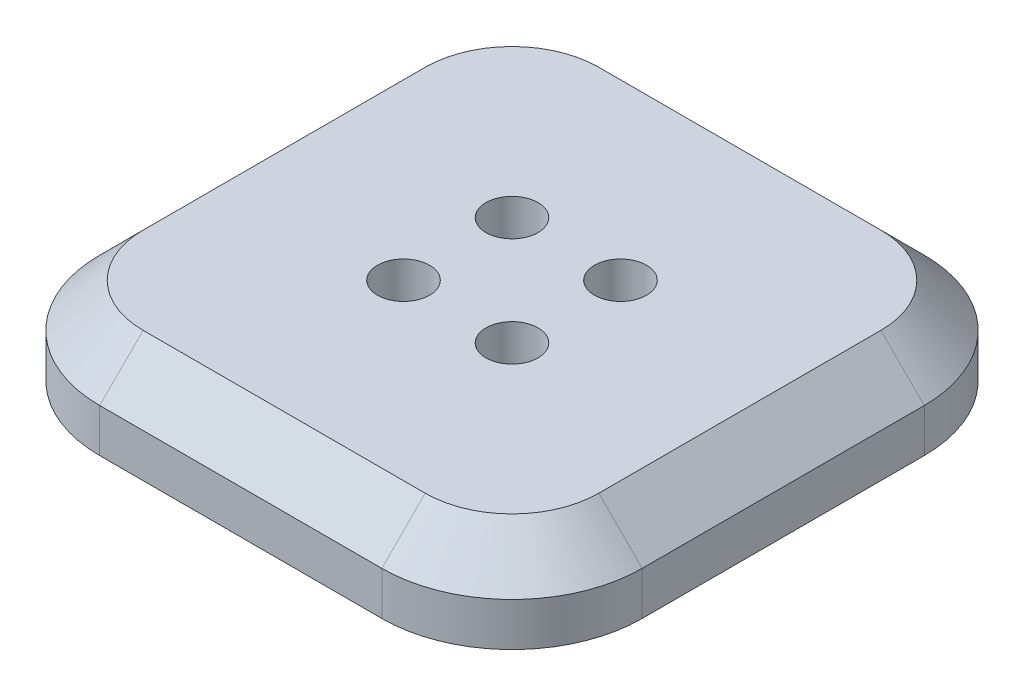
ISO-10303-21;
HEADER;
FILE_DESCRIPTION(('STEP AP214'),'2;1');
FILE_NAME('part.step','',(''),(''),'','','');
FILE_SCHEMA(('AUTOMOTIVE_DESIGN { 1 0 10303 214 1 1 1 1 }'));
ENDSEC;
DATA;
#1=APPLICATION_CONTEXT('core data for automotive mechanical design processes');
#2=APPLICATION_PROTOCOL_DEFINITION('international standard','automotive_design',2000,#1);
#3=PRODUCT_CONTEXT('',#1,'mechanical');
#4=PRODUCT('Part','Part','',(#3));
#5=PRODUCT_RELATED_PRODUCT_CATEGORY('part','',(#4));
#6=PRODUCT_DEFINITION_FORMATION('','',#4);
#7=PRODUCT_DEFINITION_CONTEXT('part definition',#1,'design');
#8=PRODUCT_DEFINITION('design','',#6,#7);
#9=PRODUCT_DEFINITION_SHAPE('','',#8);
#10=(LENGTH_UNIT() NAMED_UNIT(*) SI_UNIT(.MILLI.,.METRE.));
#11=(NAMED_UNIT(*) PLANE_ANGLE_UNIT() SI_UNIT($,.RADIAN.));
#12=(NAMED_UNIT(*) SI_UNIT($,.STERADIAN.) SOLID_ANGLE_UNIT());
#13=UNCERTAINTY_MEASURE_WITH_UNIT(LENGTH_MEASURE(1.E-05),#10,'distance_accuracy_value','');
#14=(GEOMETRIC_REPRESENTATION_CONTEXT(3) GLOBAL_UNCERTAINTY_ASSIGNED_CONTEXT((#13)) GLOBAL_UNIT_ASSIGNED_CONTEXT((#10,
#11,#12)) REPRESENTATION_CONTEXT('',''));
#15=CARTESIAN_POINT('',(0.,0.,0.));
#16=DIRECTION('',(0.,0.,1.));
#17=DIRECTION('',(1.,0.,0.));
#18=AXIS2_PLACEMENT_3D('',#15,#16,#17);
#19=CARTESIAN_POINT('',(0.,20.,0.));
#20=DIRECTION('',(1.,0.,0.));
#21=DIRECTION('',(0.,0.,-1.));
#22=AXIS2_PLACEMENT_3D('',#19,#20,#21);
#23=PLANE('',#22);
#24=DIRECTION('',(0.,-1.,0.));
#25=VECTOR('',#24,1.);
#26=CARTESIAN_POINT('',(0.,20.,-30.));
#27=LINE('',#26,#25);
#28=CARTESIAN_POINT('',(0.,0.,-30.));
#29=VERTEX_POINT('',#28);
#30=CARTESIAN_POINT('',(0.,9.99999999999996,-30.));
#31=VERTEX_POINT('',#30);
#32=EDGE_CURVE('E217',#29,#31,#27,.F.);
#33=ORIENTED_EDGE('',*,*,#32,.T.);
#34=DIRECTION('',(0.,0.,-1.));
#35=VECTOR('',#34,1.);
#36=CARTESIAN_POINT('',(0.,9.99999999999996,0.));
#37=LINE('',#36,#35);
#38=CARTESIAN_POINT('',(0.,9.99999999999996,-95.));
#39=VERTEX_POINT('',#38);
#40=EDGE_CURVE('E261',#31,#39,#37,.T.);
#41=ORIENTED_EDGE('',*,*,#40,.T.);
#42=DIRECTION('',(0.,-1.,0.));
#43=VECTOR('',#42,1.);
#44=CARTESIAN_POINT('',(0.,20.,-95.));
#45=LINE('',#44,#43);
#46=CARTESIAN_POINT('',(0.,0.,-95.));
#47=VERTEX_POINT('',#46);
#48=EDGE_CURVE('E220',#39,#47,#45,.T.);
#49=ORIENTED_EDGE('',*,*,#48,.T.);
#50=DIRECTION('',(0.,0.,1.));
#51=VECTOR('',#50,1.);
#52=CARTESIAN_POINT('',(0.,0.,0.));
#53=LINE('',#52,#51);
#54=EDGE_CURVE('E205',#47,#29,#53,.T.);
#55=ORIENTED_EDGE('',*,*,#54,.T.);
#56=EDGE_LOOP('',(#33,#41,#49,#55));
#57=FACE_BOUND('',#56,.T.);
#58=ADVANCED_FACE('F35',(#57),#23,.F.);
#59=CARTESIAN_POINT('',(0.,20.,0.));
#60=DIRECTION('',(0.,0.,-1.));
#61=DIRECTION('',(-1.,0.,0.));
#62=AXIS2_PLACEMENT_3D('',#59,#60,#61);
#63=PLANE('',#62);
#64=DIRECTION('',(0.,-1.,0.));
#65=VECTOR('',#64,1.);
#66=CARTESIAN_POINT('',(95.,20.,0.));
#67=LINE('',#66,#65);
#68=CARTESIAN_POINT('',(95.,0.,0.));
#69=VERTEX_POINT('',#68);
#70=CARTESIAN_POINT('',(95.,9.99999999999996,0.));
#71=VERTEX_POINT('',#70);
#72=EDGE_CURVE('E241',#69,#71,#67,.F.);
#73=ORIENTED_EDGE('',*,*,#72,.T.);
#74=DIRECTION('',(-1.,0.,0.));
#75=VECTOR('',#74,1.);
#76=CARTESIAN_POINT('',(0.,9.99999999999996,0.));
#77=LINE('',#76,#75);
#78=CARTESIAN_POINT('',(30.,9.99999999999996,0.));
#79=VERTEX_POINT('',#78);
#80=EDGE_CURVE('E268',#71,#79,#77,.T.);
#81=ORIENTED_EDGE('',*,*,#80,.T.);
#82=DIRECTION('',(0.,-1.,0.));
#83=VECTOR('',#82,1.);
#84=CARTESIAN_POINT('',(30.,20.,0.));
#85=LINE('',#84,#83);
#86=CARTESIAN_POINT('',(30.,0.,0.));
#87=VERTEX_POINT('',#86);
#88=EDGE_CURVE('E239',#79,#87,#85,.T.);
#89=ORIENTED_EDGE('',*,*,#88,.T.);
#90=DIRECTION('',(1.,0.,0.));
#91=VECTOR('',#90,1.);
#92=CARTESIAN_POINT('',(0.,0.,0.));
#93=LINE('',#92,#91);
#94=EDGE_CURVE('E208',#87,#69,#93,.T.);
#95=ORIENTED_EDGE('',*,*,#94,.T.);
#96=EDGE_LOOP('',(#73,#81,#89,#95));
#97=FACE_BOUND('',#96,.T.);
#98=ADVANCED_FACE('F311',(#97),#63,.F.);
#99=CARTESIAN_POINT('',(125.,20.,0.));
#100=DIRECTION('',(-1.,0.,0.));
#101=DIRECTION('',(0.,0.,1.));
#102=AXIS2_PLACEMENT_3D('',#99,#100,#101);
#103=PLANE('',#102);
#104=DIRECTION('',(0.,-1.,0.));
#105=VECTOR('',#104,1.);
#106=CARTESIAN_POINT('',(125.,20.,-95.));
#107=LINE('',#106,#105);
#108=CARTESIAN_POINT('',(125.,0.,-95.));
#109=VERTEX_POINT('',#108);
#110=CARTESIAN_POINT('',(125.,9.99999999999996,-95.));
#111=VERTEX_POINT('',#110);
#112=EDGE_CURVE('E237',#109,#111,#107,.F.);
#113=ORIENTED_EDGE('',*,*,#112,.T.);
#114=DIRECTION('',(0.,0.,1.));
#115=VECTOR('',#114,1.);
#116=CARTESIAN_POINT('',(125.,9.99999999999996,0.));
#117=LINE('',#116,#115);
#118=CARTESIAN_POINT('',(125.,9.99999999999996,-30.));
#119=VERTEX_POINT('',#118);
#120=EDGE_CURVE('E11',#111,#119,#117,.T.);
#121=ORIENTED_EDGE('',*,*,#120,.T.);
#122=DIRECTION('',(0.,-1.,0.));
#123=VECTOR('',#122,1.);
#124=CARTESIAN_POINT('',(125.,20.,-30.));
#125=LINE('',#124,#123);
#126=CARTESIAN_POINT('',(125.,0.,-30.));
#127=VERTEX_POINT('',#126);
#128=EDGE_CURVE('E235',#119,#127,#125,.T.);
#129=ORIENTED_EDGE('',*,*,#128,.T.);
#130=DIRECTION('',(0.,0.,-1.));
#131=VECTOR('',#130,1.);
#132=CARTESIAN_POINT('',(125.,0.,0.));
#133=LINE('',#132,#131);
#134=EDGE_CURVE('E211',#127,#109,#133,.T.);
#135=ORIENTED_EDGE('',*,*,#134,.T.);
#136=EDGE_LOOP('',(#113,#121,#129,#135));
#137=FACE_BOUND('',#136,.T.);
#138=ADVANCED_FACE('F321',(#137),#103,.F.);
#139=CARTESIAN_POINT('',(0.,20.,-125.));
#140=DIRECTION('',(0.,0.,1.));
#141=DIRECTION('',(1.,0.,0.));
#142=AXIS2_PLACEMENT_3D('',#139,#140,#141);
#143=PLANE('',#142);
#144=DIRECTION('',(0.,-1.,0.));
#145=VECTOR('',#144,1.);
#146=CARTESIAN_POINT('',(30.,20.,-125.));
#147=LINE('',#146,#145);
#148=CARTESIAN_POINT('',(30.,0.,-125.));
#149=VERTEX_POINT('',#148);
#150=CARTESIAN_POINT('',(30.,9.99999999999996,-125.));
#151=VERTEX_POINT('',#150);
#152=EDGE_CURVE('E232',#149,#151,#147,.F.);
#153=ORIENTED_EDGE('',*,*,#152,.T.);
#154=DIRECTION('',(1.,0.,0.));
#155=VECTOR('',#154,1.);
#156=CARTESIAN_POINT('',(0.,9.99999999999996,-125.));
#157=LINE('',#156,#155);
#158=CARTESIAN_POINT('',(95.,9.99999999999996,-125.));
#159=VERTEX_POINT('',#158);
#160=EDGE_CURVE('E270',#151,#159,#157,.T.);
#161=ORIENTED_EDGE('',*,*,#160,.T.);
#162=DIRECTION('',(0.,-1.,0.));
#163=VECTOR('',#162,1.);
#164=CARTESIAN_POINT('',(95.,20.,-125.));
#165=LINE('',#164,#163);
#166=CARTESIAN_POINT('',(95.,0.,-125.));
#167=VERTEX_POINT('',#166);
#168=EDGE_CURVE('E230',#159,#167,#165,.T.);
#169=ORIENTED_EDGE('',*,*,#168,.T.);
#170=DIRECTION('',(-1.,0.,0.));
#171=VECTOR('',#170,1.);
#172=CARTESIAN_POINT('',(0.,0.,-125.));
#173=LINE('',#172,#171);
#174=EDGE_CURVE('E214',#167,#149,#173,.T.);
#175=ORIENTED_EDGE('',*,*,#174,.T.);
#176=EDGE_LOOP('',(#153,#161,#169,#175));
#177=FACE_BOUND('',#176,.T.);
#178=ADVANCED_FACE('F326',(#177),#143,.F.);
#179=CARTESIAN_POINT('',(0.,20.,0.));
#180=DIRECTION('',(0.,-1.,0.));
#181=DIRECTION('',(0.,0.,-1.));
#182=AXIS2_PLACEMENT_3D('',#179,#180,#181);
#183=PLANE('',#182);
#184=CARTESIAN_POINT('',(50.,20.,-50.));
#185=DIRECTION('',(0.,1.,0.));
#186=DIRECTION('',(0.,0.,1.));
#187=AXIS2_PLACEMENT_3D('',#184,#185,#186);
#188=CIRCLE('',#187,5.99999999999999);
#189=CARTESIAN_POINT('',(50.,20.,-44.));
#190=VERTEX_POINT('',#189);
#191=EDGE_CURVE('E158',#190,#190,#188,.T.);
#192=ORIENTED_EDGE('',*,*,#191,.F.);
#193=EDGE_LOOP('',(#192));
#194=FACE_BOUND('',#193,.T.);
#195=CARTESIAN_POINT('',(50.,20.,-75.));
#196=DIRECTION('',(0.,1.,0.));
#197=DIRECTION('',(0.,0.,1.));
#198=AXIS2_PLACEMENT_3D('',#195,#196,#197);
#199=CIRCLE('',#198,5.99999999999999);
#200=CARTESIAN_POINT('',(50.,20.,-69.));
#201=VERTEX_POINT('',#200);
#202=EDGE_CURVE('E157',#201,#201,#199,.T.);
#203=ORIENTED_EDGE('',*,*,#202,.F.);
#204=EDGE_LOOP('',(#203));
#205=FACE_BOUND('',#204,.T.);
#206=CARTESIAN_POINT('',(75.,20.,-75.));
#207=DIRECTION('',(0.,1.,0.));
#208=DIRECTION('',(0.,0.,1.));
#209=AXIS2_PLACEMENT_3D('',#206,#207,#208);
#210=CIRCLE('',#209,5.99999999999999);
#211=CARTESIAN_POINT('',(75.,20.,-69.));
#212=VERTEX_POINT('',#211);
#213=EDGE_CURVE('E168',#212,#212,#210,.T.);
#214=ORIENTED_EDGE('',*,*,#213,.F.);
#215=EDGE_LOOP('',(#214));
#216=FACE_BOUND('',#215,.T.);
#217=CARTESIAN_POINT('',(75.,20.,-50.));
#218=DIRECTION('',(0.,1.,0.));
#219=DIRECTION('',(0.,0.,1.));
#220=AXIS2_PLACEMENT_3D('',#217,#218,#219);
#221=CIRCLE('',#220,5.99999999999999);
#222=CARTESIAN_POINT('',(75.,20.,-44.));
#223=VERTEX_POINT('',#222);
#224=EDGE_CURVE('E174',#223,#223,#221,.T.);
#225=ORIENTED_EDGE('',*,*,#224,.F.);
#226=EDGE_LOOP('',(#225));
#227=FACE_BOUND('',#226,.T.);
#228=CARTESIAN_POINT('',(30.,20.,-95.));
#229=DIRECTION('',(0.,-1.,0.));
#230=DIRECTION('',(0.,0.,-1.));
#231=AXIS2_PLACEMENT_3D('',#228,#229,#230);
#232=CIRCLE('',#231,20.);
#233=CARTESIAN_POINT('',(30.,20.,-115.));
#234=VERTEX_POINT('',#233);
#235=CARTESIAN_POINT('',(10.,20.,-95.));
#236=VERTEX_POINT('',#235);
#237=EDGE_CURVE('E254',#234,#236,#232,.F.);
#238=ORIENTED_EDGE('',*,*,#237,.T.);
#239=DIRECTION('',(0.,0.,1.));
#240=VECTOR('',#239,1.);
#241=CARTESIAN_POINT('',(10.,20.,0.));
#242=LINE('',#241,#240);
#243=CARTESIAN_POINT('',(10.,20.,-30.));
#244=VERTEX_POINT('',#243);
#245=EDGE_CURVE('E258',#236,#244,#242,.T.);
#246=ORIENTED_EDGE('',*,*,#245,.T.);
#247=CARTESIAN_POINT('',(30.,20.,-30.));
#248=DIRECTION('',(0.,-1.,0.));
#249=DIRECTION('',(0.,0.,-1.));
#250=AXIS2_PLACEMENT_3D('',#247,#248,#249);
#251=CIRCLE('',#250,20.);
#252=CARTESIAN_POINT('',(30.,20.,-10.));
#253=VERTEX_POINT('',#252);
#254=EDGE_CURVE('E256',#244,#253,#251,.F.);
#255=ORIENTED_EDGE('',*,*,#254,.T.);
#256=DIRECTION('',(1.,0.,0.));
#257=VECTOR('',#256,1.);
#258=CARTESIAN_POINT('',(0.,20.,-10.));
#259=LINE('',#258,#257);
#260=CARTESIAN_POINT('',(95.,20.,-10.));
#261=VERTEX_POINT('',#260);
#262=EDGE_CURVE('E252',#253,#261,#259,.T.);
#263=ORIENTED_EDGE('',*,*,#262,.T.);
#264=CARTESIAN_POINT('',(95.,20.,-30.));
#265=DIRECTION('',(0.,-1.,0.));
#266=DIRECTION('',(0.,0.,-1.));
#267=AXIS2_PLACEMENT_3D('',#264,#265,#266);
#268=CIRCLE('',#267,20.);
#269=CARTESIAN_POINT('',(115.,20.,-30.));
#270=VERTEX_POINT('',#269);
#271=EDGE_CURVE('E248',#261,#270,#268,.F.);
#272=ORIENTED_EDGE('',*,*,#271,.T.);
#273=DIRECTION('',(0.,0.,-1.));
#274=VECTOR('',#273,1.);
#275=CARTESIAN_POINT('',(115.,20.,0.));
#276=LINE('',#275,#274);
#277=CARTESIAN_POINT('',(115.,20.,-95.));
#278=VERTEX_POINT('',#277);
#279=EDGE_CURVE('E244',#270,#278,#276,.T.);
#280=ORIENTED_EDGE('',*,*,#279,.T.);
#281=CARTESIAN_POINT('',(95.,20.,-95.));
#282=DIRECTION('',(0.,-1.,0.));
#283=DIRECTION('',(0.,0.,-1.));
#284=AXIS2_PLACEMENT_3D('',#281,#282,#283);
#285=CIRCLE('',#284,20.);
#286=CARTESIAN_POINT('',(95.,20.,-115.));
#287=VERTEX_POINT('',#286);
#288=EDGE_CURVE('E246',#278,#287,#285,.F.);
#289=ORIENTED_EDGE('',*,*,#288,.T.);
#290=DIRECTION('',(-1.,0.,0.));
#291=VECTOR('',#290,1.);
#292=CARTESIAN_POINT('',(0.,20.,-115.));
#293=LINE('',#292,#291);
#294=EDGE_CURVE('E250',#287,#234,#293,.T.);
#295=ORIENTED_EDGE('',*,*,#294,.T.);
#296=EDGE_LOOP('',(#238,#246,#255,#263,#272,#280,#289,#295));
#297=FACE_BOUND('',#296,.T.);
#298=ADVANCED_FACE('F351',(#194,#205,#216,#227,#297),#183,.F.);
#299=CARTESIAN_POINT('',(0.,0.,0.));
#300=DIRECTION('',(0.,-1.,0.));
#301=DIRECTION('',(0.,0.,-1.));
#302=AXIS2_PLACEMENT_3D('',#299,#300,#301);
#303=PLANE('',#302);
#304=CARTESIAN_POINT('',(25.,0.,-25.));
#305=DIRECTION('',(0.,-1.,0.));
#306=DIRECTION('',(0.,0.,-1.));
#307=AXIS2_PLACEMENT_3D('',#304,#305,#306);
#308=CIRCLE('',#307,5.99999999999999);
#309=CARTESIAN_POINT('',(25.,0.,-31.));
#310=VERTEX_POINT('',#309);
#311=EDGE_CURVE('E180',#310,#310,#308,.T.);
#312=ORIENTED_EDGE('',*,*,#311,.F.);
#313=EDGE_LOOP('',(#312));
#314=FACE_BOUND('',#313,.T.);
#315=CARTESIAN_POINT('',(100.,0.,-25.));
#316=DIRECTION('',(0.,-1.,0.));
#317=DIRECTION('',(0.,0.,-1.));
#318=AXIS2_PLACEMENT_3D('',#315,#316,#317);
#319=CIRCLE('',#318,5.99999999999999);
#320=CARTESIAN_POINT('',(100.,0.,-31.));
#321=VERTEX_POINT('',#320);
#322=EDGE_CURVE('E186',#321,#321,#319,.T.);
#323=ORIENTED_EDGE('',*,*,#322,.F.);
#324=EDGE_LOOP('',(#323));
#325=FACE_BOUND('',#324,.T.);
#326=CARTESIAN_POINT('',(100.,0.,-100.));
#327=DIRECTION('',(0.,-1.,0.));
#328=DIRECTION('',(0.,0.,-1.));
#329=AXIS2_PLACEMENT_3D('',#326,#327,#328);
#330=CIRCLE('',#329,5.99999999999999);
#331=CARTESIAN_POINT('',(100.,0.,-106.));
#332=VERTEX_POINT('',#331);
#333=EDGE_CURVE('E192',#332,#332,#330,.T.);
#334=ORIENTED_EDGE('',*,*,#333,.F.);
#335=EDGE_LOOP('',(#334));
#336=FACE_BOUND('',#335,.T.);
#337=CARTESIAN_POINT('',(25.,0.,-100.));
#338=DIRECTION('',(0.,-1.,0.));
#339=DIRECTION('',(0.,0.,-1.));
#340=AXIS2_PLACEMENT_3D('',#337,#338,#339);
#341=CIRCLE('',#340,5.99999999999999);
#342=CARTESIAN_POINT('',(25.,0.,-106.));
#343=VERTEX_POINT('',#342);
#344=EDGE_CURVE('E198',#343,#343,#341,.T.);
#345=ORIENTED_EDGE('',*,*,#344,.F.);
#346=EDGE_LOOP('',(#345));
#347=FACE_BOUND('',#346,.T.);
#348=ORIENTED_EDGE('',*,*,#54,.F.);
#349=CARTESIAN_POINT('',(30.,0.,-95.));
#350=DIRECTION('',(0.,-1.,0.));
#351=DIRECTION('',(0.,0.,-1.));
#352=AXIS2_PLACEMENT_3D('',#349,#350,#351);
#353=CIRCLE('',#352,30.);
#354=EDGE_CURVE('E228',#47,#149,#353,.T.);
#355=ORIENTED_EDGE('',*,*,#354,.T.);
#356=ORIENTED_EDGE('',*,*,#174,.F.);
#357=CARTESIAN_POINT('',(95.,0.,-95.));
#358=DIRECTION('',(0.,-1.,0.));
#359=DIRECTION('',(0.,0.,-1.));
#360=AXIS2_PLACEMENT_3D('',#357,#358,#359);
#361=CIRCLE('',#360,30.);
#362=EDGE_CURVE('E226',#167,#109,#361,.T.);
#363=ORIENTED_EDGE('',*,*,#362,.T.);
#364=ORIENTED_EDGE('',*,*,#134,.F.);
#365=CARTESIAN_POINT('',(95.,0.,-30.));
#366=DIRECTION('',(0.,-1.,0.));
#367=DIRECTION('',(0.,0.,-1.));
#368=AXIS2_PLACEMENT_3D('',#365,#366,#367);
#369=CIRCLE('',#368,30.);
#370=EDGE_CURVE('E224',#127,#69,#369,.T.);
#371=ORIENTED_EDGE('',*,*,#370,.T.);
#372=ORIENTED_EDGE('',*,*,#94,.F.);
#373=CARTESIAN_POINT('',(30.,0.,-30.));
#374=DIRECTION('',(0.,-1.,0.));
#375=DIRECTION('',(0.,0.,-1.));
#376=AXIS2_PLACEMENT_3D('',#373,#374,#375);
#377=CIRCLE('',#376,30.);
#378=EDGE_CURVE('E222',#87,#29,#377,.T.);
#379=ORIENTED_EDGE('',*,*,#378,.T.);
#380=EDGE_LOOP('',(#348,#355,#356,#363,#364,#371,#372,#379));
#381=FACE_BOUND('',#380,.T.);
#382=ADVANCED_FACE('F317',(#314,#325,#336,#347,#381),#303,.T.);
#383=CARTESIAN_POINT('',(30.,20.,-95.));
#384=DIRECTION('',(0.,-1.,0.));
#385=DIRECTION('',(0.,0.,-1.));
#386=AXIS2_PLACEMENT_3D('',#383,#384,#385);
#387=CYLINDRICAL_SURFACE('',#386,30.);
#388=ORIENTED_EDGE('',*,*,#48,.F.);
#389=CARTESIAN_POINT('',(30.,9.99999999999996,-95.));
#390=DIRECTION('',(0.,-1.,0.));
#391=DIRECTION('',(0.,0.,-1.));
#392=AXIS2_PLACEMENT_3D('',#389,#390,#391);
#393=CIRCLE('',#392,30.);
#394=EDGE_CURVE('E266',#39,#151,#393,.T.);
#395=ORIENTED_EDGE('',*,*,#394,.T.);
#396=ORIENTED_EDGE('',*,*,#152,.F.);
#397=ORIENTED_EDGE('',*,*,#354,.F.);
#398=EDGE_LOOP('',(#388,#395,#396,#397));
#399=FACE_BOUND('',#398,.T.);
#400=ADVANCED_FACE('F330',(#399),#387,.T.);
#401=CARTESIAN_POINT('',(95.,20.,-95.));
#402=DIRECTION('',(0.,-1.,0.));
#403=DIRECTION('',(0.,0.,-1.));
#404=AXIS2_PLACEMENT_3D('',#401,#402,#403);
#405=CYLINDRICAL_SURFACE('',#404,30.);
#406=ORIENTED_EDGE('',*,*,#168,.F.);
#407=CARTESIAN_POINT('',(95.,9.99999999999996,-95.));
#408=DIRECTION('',(0.,-1.,0.));
#409=DIRECTION('',(0.,0.,-1.));
#410=AXIS2_PLACEMENT_3D('',#407,#408,#409);
#411=CIRCLE('',#410,30.);
#412=EDGE_CURVE('E44',#159,#111,#411,.T.);
#413=ORIENTED_EDGE('',*,*,#412,.T.);
#414=ORIENTED_EDGE('',*,*,#112,.F.);
#415=ORIENTED_EDGE('',*,*,#362,.F.);
#416=EDGE_LOOP('',(#406,#413,#414,#415));
#417=FACE_BOUND('',#416,.T.);
#418=ADVANCED_FACE('F322',(#417),#405,.T.);
#419=CARTESIAN_POINT('',(95.,20.,-30.));
#420=DIRECTION('',(0.,-1.,0.));
#421=DIRECTION('',(0.,0.,-1.));
#422=AXIS2_PLACEMENT_3D('',#419,#420,#421);
#423=CYLINDRICAL_SURFACE('',#422,30.);
#424=ORIENTED_EDGE('',*,*,#128,.F.);
#425=CARTESIAN_POINT('',(95.,9.99999999999996,-30.));
#426=DIRECTION('',(0.,-1.,0.));
#427=DIRECTION('',(0.,0.,-1.));
#428=AXIS2_PLACEMENT_3D('',#425,#426,#427);
#429=CIRCLE('',#428,30.);
#430=EDGE_CURVE('E272',#119,#71,#429,.T.);
#431=ORIENTED_EDGE('',*,*,#430,.T.);
#432=ORIENTED_EDGE('',*,*,#72,.F.);
#433=ORIENTED_EDGE('',*,*,#370,.F.);
#434=EDGE_LOOP('',(#424,#431,#432,#433));
#435=FACE_BOUND('',#434,.T.);
#436=ADVANCED_FACE('F308',(#435),#423,.T.);
#437=CARTESIAN_POINT('',(30.,20.,-30.));
#438=DIRECTION('',(0.,-1.,0.));
#439=DIRECTION('',(0.,0.,-1.));
#440=AXIS2_PLACEMENT_3D('',#437,#438,#439);
#441=CYLINDRICAL_SURFACE('',#440,30.);
#442=ORIENTED_EDGE('',*,*,#88,.F.);
#443=CARTESIAN_POINT('',(30.,9.99999999999996,-30.));
#444=DIRECTION('',(0.,-1.,0.));
#445=DIRECTION('',(0.,0.,-1.));
#446=AXIS2_PLACEMENT_3D('',#443,#444,#445);
#447=CIRCLE('',#446,30.);
#448=EDGE_CURVE('E264',#79,#31,#447,.T.);
#449=ORIENTED_EDGE('',*,*,#448,.T.);
#450=ORIENTED_EDGE('',*,*,#32,.F.);
#451=ORIENTED_EDGE('',*,*,#378,.F.);
#452=EDGE_LOOP('',(#442,#449,#450,#451));
#453=FACE_BOUND('',#452,.T.);
#454=ADVANCED_FACE('F379',(#453),#441,.T.);
#455=CARTESIAN_POINT('',(115.,20.,0.));
#456=DIRECTION('',(-0.707106781186549,-0.707106781186547,0.));
#457=DIRECTION('',(0.,0.,-1.));
#458=AXIS2_PLACEMENT_3D('',#455,#456,#457);
#459=PLANE('',#458);
#460=DIRECTION('',(-0.707106781186547,0.707106781186549,0.));
#461=VECTOR('',#460,1.);
#462=CARTESIAN_POINT('',(125.,9.99999999999996,-30.));
#463=LINE('',#462,#461);
#464=EDGE_CURVE('E289',#119,#270,#463,.T.);
#465=ORIENTED_EDGE('',*,*,#464,.F.);
#466=ORIENTED_EDGE('',*,*,#120,.F.);
#467=DIRECTION('',(0.707106781186547,-0.707106781186549,0.));
#468=VECTOR('',#467,1.);
#469=CARTESIAN_POINT('',(115.,20.,-95.));
#470=LINE('',#469,#468);
#471=EDGE_CURVE('E39',#278,#111,#470,.T.);
#472=ORIENTED_EDGE('',*,*,#471,.F.);
#473=ORIENTED_EDGE('',*,*,#279,.F.);
#474=EDGE_LOOP('',(#465,#466,#472,#473));
#475=FACE_BOUND('',#474,.T.);
#476=ADVANCED_FACE('F37',(#475),#459,.F.);
#477=CARTESIAN_POINT('',(95.,20.,-95.));
#478=DIRECTION('',(0.,-1.,0.));
#479=DIRECTION('',(0.,0.,-1.));
#480=AXIS2_PLACEMENT_3D('',#477,#478,#479);
#481=CONICAL_SURFACE('',#480,20.,0.785398163397447);
#482=ORIENTED_EDGE('',*,*,#471,.T.);
#483=ORIENTED_EDGE('',*,*,#412,.F.);
#484=DIRECTION('',(0.,-0.707106781186549,-0.707106781186547));
#485=VECTOR('',#484,1.);
#486=CARTESIAN_POINT('',(95.,20.,-115.));
#487=LINE('',#486,#485);
#488=EDGE_CURVE('E287',#287,#159,#487,.T.);
#489=ORIENTED_EDGE('',*,*,#488,.F.);
#490=ORIENTED_EDGE('',*,*,#288,.F.);
#491=EDGE_LOOP('',(#482,#483,#489,#490));
#492=FACE_BOUND('',#491,.T.);
#493=ADVANCED_FACE('F299',(#492),#481,.T.);
#494=CARTESIAN_POINT('',(95.,20.,-30.));
#495=DIRECTION('',(0.,-1.,0.));
#496=DIRECTION('',(0.,0.,-1.));
#497=AXIS2_PLACEMENT_3D('',#494,#495,#496);
#498=CONICAL_SURFACE('',#497,20.,0.785398163397447);
#499=ORIENTED_EDGE('',*,*,#464,.T.);
#500=ORIENTED_EDGE('',*,*,#271,.F.);
#501=DIRECTION('',(0.,0.707106781186549,-0.707106781186547));
#502=VECTOR('',#501,1.);
#503=CARTESIAN_POINT('',(95.,9.99999999999996,0.));
#504=LINE('',#503,#502);
#505=EDGE_CURVE('E284',#71,#261,#504,.T.);
#506=ORIENTED_EDGE('',*,*,#505,.F.);
#507=ORIENTED_EDGE('',*,*,#430,.F.);
#508=EDGE_LOOP('',(#499,#500,#506,#507));
#509=FACE_BOUND('',#508,.T.);
#510=ADVANCED_FACE('F304',(#509),#498,.T.);
#511=CARTESIAN_POINT('',(0.,20.,-115.));
#512=DIRECTION('',(0.,-0.707106781186547,0.707106781186549));
#513=DIRECTION('',(-1.,0.,0.));
#514=AXIS2_PLACEMENT_3D('',#511,#512,#513);
#515=PLANE('',#514);
#516=ORIENTED_EDGE('',*,*,#488,.T.);
#517=ORIENTED_EDGE('',*,*,#160,.F.);
#518=DIRECTION('',(0.,-0.707106781186549,-0.707106781186547));
#519=VECTOR('',#518,1.);
#520=CARTESIAN_POINT('',(30.,20.,-115.));
#521=LINE('',#520,#519);
#522=EDGE_CURVE('E281',#234,#151,#521,.T.);
#523=ORIENTED_EDGE('',*,*,#522,.F.);
#524=ORIENTED_EDGE('',*,*,#294,.F.);
#525=EDGE_LOOP('',(#516,#517,#523,#524));
#526=FACE_BOUND('',#525,.T.);
#527=ADVANCED_FACE('F354',(#526),#515,.F.);
#528=CARTESIAN_POINT('',(0.,20.,-10.));
#529=DIRECTION('',(0.,-0.707106781186547,-0.707106781186549));
#530=DIRECTION('',(1.,0.,0.));
#531=AXIS2_PLACEMENT_3D('',#528,#529,#530);
#532=PLANE('',#531);
#533=ORIENTED_EDGE('',*,*,#505,.T.);
#534=ORIENTED_EDGE('',*,*,#262,.F.);
#535=DIRECTION('',(0.,0.707106781186549,-0.707106781186547));
#536=VECTOR('',#535,1.);
#537=CARTESIAN_POINT('',(30.,9.99999999999996,0.));
#538=LINE('',#537,#536);
#539=EDGE_CURVE('E278',#79,#253,#538,.T.);
#540=ORIENTED_EDGE('',*,*,#539,.F.);
#541=ORIENTED_EDGE('',*,*,#80,.F.);
#542=EDGE_LOOP('',(#533,#534,#540,#541));
#543=FACE_BOUND('',#542,.T.);
#544=ADVANCED_FACE('F356',(#543),#532,.F.);
#545=CARTESIAN_POINT('',(30.,20.,-95.));
#546=DIRECTION('',(0.,-1.,0.));
#547=DIRECTION('',(0.,0.,-1.));
#548=AXIS2_PLACEMENT_3D('',#545,#546,#547);
#549=CONICAL_SURFACE('',#548,20.,0.785398163397447);
#550=ORIENTED_EDGE('',*,*,#522,.T.);
#551=ORIENTED_EDGE('',*,*,#394,.F.);
#552=DIRECTION('',(-0.707106781186547,-0.707106781186549,0.));
#553=VECTOR('',#552,1.);
#554=CARTESIAN_POINT('',(10.,20.,-95.));
#555=LINE('',#554,#553);
#556=EDGE_CURVE('E276',#236,#39,#555,.T.);
#557=ORIENTED_EDGE('',*,*,#556,.F.);
#558=ORIENTED_EDGE('',*,*,#237,.F.);
#559=EDGE_LOOP('',(#550,#551,#557,#558));
#560=FACE_BOUND('',#559,.T.);
#561=ADVANCED_FACE('F334',(#560),#549,.T.);
#562=CARTESIAN_POINT('',(30.,20.,-30.));
#563=DIRECTION('',(0.,-1.,0.));
#564=DIRECTION('',(0.,0.,-1.));
#565=AXIS2_PLACEMENT_3D('',#562,#563,#564);
#566=CONICAL_SURFACE('',#565,20.,0.785398163397447);
#567=ORIENTED_EDGE('',*,*,#539,.T.);
#568=ORIENTED_EDGE('',*,*,#254,.F.);
#569=DIRECTION('',(0.707106781186547,0.707106781186549,0.));
#570=VECTOR('',#569,1.);
#571=CARTESIAN_POINT('',(0.,9.99999999999996,-30.));
#572=LINE('',#571,#570);
#573=EDGE_CURVE('E204',#31,#244,#572,.T.);
#574=ORIENTED_EDGE('',*,*,#573,.F.);
#575=ORIENTED_EDGE('',*,*,#448,.F.);
#576=EDGE_LOOP('',(#567,#568,#574,#575));
#577=FACE_BOUND('',#576,.T.);
#578=ADVANCED_FACE('F347',(#577),#566,.T.);
#579=CARTESIAN_POINT('',(10.,20.,0.));
#580=DIRECTION('',(0.707106781186549,-0.707106781186547,0.));
#581=DIRECTION('',(0.,0.,1.));
#582=AXIS2_PLACEMENT_3D('',#579,#580,#581);
#583=PLANE('',#582);
#584=ORIENTED_EDGE('',*,*,#556,.T.);
#585=ORIENTED_EDGE('',*,*,#40,.F.);
#586=ORIENTED_EDGE('',*,*,#573,.T.);
#587=ORIENTED_EDGE('',*,*,#245,.F.);
#588=EDGE_LOOP('',(#584,#585,#586,#587));
#589=FACE_BOUND('',#588,.T.);
#590=ADVANCED_FACE('F343',(#589),#583,.F.);
#591=CARTESIAN_POINT('',(25.,9.99999999999999,-100.));
#592=DIRECTION('',(0.,-1.,0.));
#593=DIRECTION('',(0.,0.,-1.));
#594=AXIS2_PLACEMENT_3D('',#591,#592,#593);
#595=CONICAL_SURFACE('',#594,5.99999999999999,1.02974425867666);
#596=CARTESIAN_POINT('',(25.,13.6051637141653,-100.));
#597=VERTEX_POINT('',#596);
#598=VERTEX_LOOP('',#597);
#599=FACE_BOUND('',#598,.T.);
#600=CARTESIAN_POINT('',(25.,9.99999999999999,-100.));
#601=DIRECTION('',(0.,-1.,0.));
#602=DIRECTION('',(0.,0.,-1.));
#603=AXIS2_PLACEMENT_3D('',#600,#601,#602);
#604=CIRCLE('',#603,5.99999999999999);
#605=CARTESIAN_POINT('',(25.,9.99999999999999,-106.));
#606=VERTEX_POINT('',#605);
#607=EDGE_CURVE('E201',#606,#606,#604,.T.);
#608=ORIENTED_EDGE('',*,*,#607,.T.);
#609=EDGE_LOOP('',(#608));
#610=FACE_BOUND('',#609,.T.);
#611=ADVANCED_FACE('F385',(#599,#610),#595,.F.);
#612=CARTESIAN_POINT('',(25.,0.,-100.));
#613=DIRECTION('',(0.,-1.,0.));
#614=DIRECTION('',(0.,0.,-1.));
#615=AXIS2_PLACEMENT_3D('',#612,#613,#614);
#616=CYLINDRICAL_SURFACE('',#615,5.99999999999999);
#617=ORIENTED_EDGE('',*,*,#607,.F.);
#618=EDGE_LOOP('',(#617));
#619=FACE_BOUND('',#618,.T.);
#620=ORIENTED_EDGE('',*,*,#344,.T.);
#621=EDGE_LOOP('',(#620));
#622=FACE_BOUND('',#621,.T.);
#623=ADVANCED_FACE('F408',(#619,#622),#616,.F.);
#624=CARTESIAN_POINT('',(100.,9.99999999999999,-100.));
#625=DIRECTION('',(0.,-1.,0.));
#626=DIRECTION('',(0.,0.,-1.));
#627=AXIS2_PLACEMENT_3D('',#624,#625,#626);
#628=CONICAL_SURFACE('',#627,5.99999999999999,1.02974425867666);
#629=CARTESIAN_POINT('',(100.,13.6051637141653,-100.));
#630=VERTEX_POINT('',#629);
#631=VERTEX_LOOP('',#630);
#632=FACE_BOUND('',#631,.T.);
#633=CARTESIAN_POINT('',(100.,9.99999999999999,-100.));
#634=DIRECTION('',(0.,-1.,0.));
#635=DIRECTION('',(0.,0.,-1.));
#636=AXIS2_PLACEMENT_3D('',#633,#634,#635);
#637=CIRCLE('',#636,5.99999999999999);
#638=CARTESIAN_POINT('',(100.,9.99999999999999,-106.));
#639=VERTEX_POINT('',#638);
#640=EDGE_CURVE('E195',#639,#639,#637,.T.);
#641=ORIENTED_EDGE('',*,*,#640,.T.);
#642=EDGE_LOOP('',(#641));
#643=FACE_BOUND('',#642,.T.);
#644=ADVANCED_FACE('F417',(#632,#643),#628,.F.);
#645=CARTESIAN_POINT('',(100.,0.,-100.));
#646=DIRECTION('',(0.,-1.,0.));
#647=DIRECTION('',(0.,0.,-1.));
#648=AXIS2_PLACEMENT_3D('',#645,#646,#647);
#649=CYLINDRICAL_SURFACE('',#648,5.99999999999999);
#650=ORIENTED_EDGE('',*,*,#640,.F.);
#651=EDGE_LOOP('',(#650));
#652=FACE_BOUND('',#651,.T.);
#653=ORIENTED_EDGE('',*,*,#333,.T.);
#654=EDGE_LOOP('',(#653));
#655=FACE_BOUND('',#654,.T.);
#656=ADVANCED_FACE('F425',(#652,#655),#649,.F.);
#657=CARTESIAN_POINT('',(100.,9.99999999999999,-25.));
#658=DIRECTION('',(0.,-1.,0.));
#659=DIRECTION('',(0.,0.,-1.));
#660=AXIS2_PLACEMENT_3D('',#657,#658,#659);
#661=CONICAL_SURFACE('',#660,5.99999999999999,1.02974425867666);
#662=CARTESIAN_POINT('',(100.,13.6051637141653,-25.));
#663=VERTEX_POINT('',#662);
#664=VERTEX_LOOP('',#663);
#665=FACE_BOUND('',#664,.T.);
#666=CARTESIAN_POINT('',(100.,9.99999999999999,-25.));
#667=DIRECTION('',(0.,-1.,0.));
#668=DIRECTION('',(0.,0.,-1.));
#669=AXIS2_PLACEMENT_3D('',#666,#667,#668);
#670=CIRCLE('',#669,5.99999999999999);
#671=CARTESIAN_POINT('',(100.,9.99999999999999,-31.));
#672=VERTEX_POINT('',#671);
#673=EDGE_CURVE('E189',#672,#672,#670,.T.);
#674=ORIENTED_EDGE('',*,*,#673,.T.);
#675=EDGE_LOOP('',(#674));
#676=FACE_BOUND('',#675,.T.);
#677=ADVANCED_FACE('F433',(#665,#676),#661,.F.);
#678=CARTESIAN_POINT('',(100.,0.,-25.));
#679=DIRECTION('',(0.,-1.,0.));
#680=DIRECTION('',(0.,0.,-1.));
#681=AXIS2_PLACEMENT_3D('',#678,#679,#680);
#682=CYLINDRICAL_SURFACE('',#681,5.99999999999999);
#683=ORIENTED_EDGE('',*,*,#673,.F.);
#684=EDGE_LOOP('',(#683));
#685=FACE_BOUND('',#684,.T.);
#686=ORIENTED_EDGE('',*,*,#322,.T.);
#687=EDGE_LOOP('',(#686));
#688=FACE_BOUND('',#687,.T.);
#689=ADVANCED_FACE('F441',(#685,#688),#682,.F.);
#690=CARTESIAN_POINT('',(25.,9.99999999999999,-25.));
#691=DIRECTION('',(0.,-1.,0.));
#692=DIRECTION('',(0.,0.,-1.));
#693=AXIS2_PLACEMENT_3D('',#690,#691,#692);
#694=CONICAL_SURFACE('',#693,5.99999999999999,1.02974425867666);
#695=CARTESIAN_POINT('',(25.,13.6051637141653,-25.));
#696=VERTEX_POINT('',#695);
#697=VERTEX_LOOP('',#696);
#698=FACE_BOUND('',#697,.T.);
#699=CARTESIAN_POINT('',(25.,9.99999999999999,-25.));
#700=DIRECTION('',(0.,-1.,0.));
#701=DIRECTION('',(0.,0.,-1.));
#702=AXIS2_PLACEMENT_3D('',#699,#700,#701);
#703=CIRCLE('',#702,5.99999999999999);
#704=CARTESIAN_POINT('',(25.,9.99999999999999,-31.));
#705=VERTEX_POINT('',#704);
#706=EDGE_CURVE('E183',#705,#705,#703,.T.);
#707=ORIENTED_EDGE('',*,*,#706,.T.);
#708=EDGE_LOOP('',(#707));
#709=FACE_BOUND('',#708,.T.);
#710=ADVANCED_FACE('F449',(#698,#709),#694,.F.);
#711=CARTESIAN_POINT('',(25.,0.,-25.));
#712=DIRECTION('',(0.,-1.,0.));
#713=DIRECTION('',(0.,0.,-1.));
#714=AXIS2_PLACEMENT_3D('',#711,#712,#713);
#715=CYLINDRICAL_SURFACE('',#714,5.99999999999999);
#716=ORIENTED_EDGE('',*,*,#706,.F.);
#717=EDGE_LOOP('',(#716));
#718=FACE_BOUND('',#717,.T.);
#719=ORIENTED_EDGE('',*,*,#311,.T.);
#720=EDGE_LOOP('',(#719));
#721=FACE_BOUND('',#720,.T.);
#722=ADVANCED_FACE('F457',(#718,#721),#715,.F.);
#723=CARTESIAN_POINT('',(75.,10.,-50.));
#724=DIRECTION('',(0.,1.,0.));
#725=DIRECTION('',(0.,0.,1.));
#726=AXIS2_PLACEMENT_3D('',#723,#724,#725);
#727=CONICAL_SURFACE('',#726,5.99999999999999,1.02974425867666);
#728=CARTESIAN_POINT('',(75.,6.39483628583466,-50.));
#729=VERTEX_POINT('',#728);
#730=VERTEX_LOOP('',#729);
#731=FACE_BOUND('',#730,.T.);
#732=CARTESIAN_POINT('',(75.,10.,-50.));
#733=DIRECTION('',(0.,1.,0.));
#734=DIRECTION('',(0.,0.,1.));
#735=AXIS2_PLACEMENT_3D('',#732,#733,#734);
#736=CIRCLE('',#735,5.99999999999999);
#737=CARTESIAN_POINT('',(75.,10.,-44.));
#738=VERTEX_POINT('',#737);
#739=EDGE_CURVE('E177',#738,#738,#736,.T.);
#740=ORIENTED_EDGE('',*,*,#739,.T.);
#741=EDGE_LOOP('',(#740));
#742=FACE_BOUND('',#741,.T.);
#743=ADVANCED_FACE('F465',(#731,#742),#727,.F.);
#744=CARTESIAN_POINT('',(75.,20.,-50.));
#745=DIRECTION('',(0.,1.,0.));
#746=DIRECTION('',(0.,0.,1.));
#747=AXIS2_PLACEMENT_3D('',#744,#745,#746);
#748=CYLINDRICAL_SURFACE('',#747,5.99999999999999);
#749=ORIENTED_EDGE('',*,*,#739,.F.);
#750=EDGE_LOOP('',(#749));
#751=FACE_BOUND('',#750,.T.);
#752=ORIENTED_EDGE('',*,*,#224,.T.);
#753=EDGE_LOOP('',(#752));
#754=FACE_BOUND('',#753,.T.);
#755=ADVANCED_FACE('F473',(#751,#754),#748,.F.);
#756=CARTESIAN_POINT('',(75.,10.,-75.));
#757=DIRECTION('',(0.,1.,0.));
#758=DIRECTION('',(0.,0.,1.));
#759=AXIS2_PLACEMENT_3D('',#756,#757,#758);
#760=CONICAL_SURFACE('',#759,5.99999999999999,1.02974425867666);
#761=CARTESIAN_POINT('',(75.,6.39483628583466,-75.));
#762=VERTEX_POINT('',#761);
#763=VERTEX_LOOP('',#762);
#764=FACE_BOUND('',#763,.T.);
#765=CARTESIAN_POINT('',(75.,10.,-75.));
#766=DIRECTION('',(0.,1.,0.));
#767=DIRECTION('',(0.,0.,1.));
#768=AXIS2_PLACEMENT_3D('',#765,#766,#767);
#769=CIRCLE('',#768,5.99999999999999);
#770=CARTESIAN_POINT('',(75.,10.,-69.));
#771=VERTEX_POINT('',#770);
#772=EDGE_CURVE('E171',#771,#771,#769,.T.);
#773=ORIENTED_EDGE('',*,*,#772,.T.);
#774=EDGE_LOOP('',(#773));
#775=FACE_BOUND('',#774,.T.);
#776=ADVANCED_FACE('F481',(#764,#775),#760,.F.);
#777=CARTESIAN_POINT('',(75.,20.,-75.));
#778=DIRECTION('',(0.,1.,0.));
#779=DIRECTION('',(0.,0.,1.));
#780=AXIS2_PLACEMENT_3D('',#777,#778,#779);
#781=CYLINDRICAL_SURFACE('',#780,5.99999999999999);
#782=ORIENTED_EDGE('',*,*,#772,.F.);
#783=EDGE_LOOP('',(#782));
#784=FACE_BOUND('',#783,.T.);
#785=ORIENTED_EDGE('',*,*,#213,.T.);
#786=EDGE_LOOP('',(#785));
#787=FACE_BOUND('',#786,.T.);
#788=ADVANCED_FACE('F489',(#784,#787),#781,.F.);
#789=CARTESIAN_POINT('',(50.,10.,-75.));
#790=DIRECTION('',(0.,1.,0.));
#791=DIRECTION('',(0.,0.,1.));
#792=AXIS2_PLACEMENT_3D('',#789,#790,#791);
#793=CONICAL_SURFACE('',#792,5.99999999999999,1.02974425867666);
#794=CARTESIAN_POINT('',(50.,6.39483628583466,-75.));
#795=VERTEX_POINT('',#794);
#796=VERTEX_LOOP('',#795);
#797=FACE_BOUND('',#796,.T.);
#798=CARTESIAN_POINT('',(50.,10.,-75.));
#799=DIRECTION('',(0.,1.,0.));
#800=DIRECTION('',(0.,0.,1.));
#801=AXIS2_PLACEMENT_3D('',#798,#799,#800);
#802=CIRCLE('',#801,5.99999999999999);
#803=CARTESIAN_POINT('',(50.,10.,-69.));
#804=VERTEX_POINT('',#803);
#805=EDGE_CURVE('E161',#804,#804,#802,.T.);
#806=ORIENTED_EDGE('',*,*,#805,.T.);
#807=EDGE_LOOP('',(#806));
#808=FACE_BOUND('',#807,.T.);
#809=ADVANCED_FACE('F497',(#797,#808),#793,.F.);
#810=CARTESIAN_POINT('',(50.,20.,-75.));
#811=DIRECTION('',(0.,1.,0.));
#812=DIRECTION('',(0.,0.,1.));
#813=AXIS2_PLACEMENT_3D('',#810,#811,#812);
#814=CYLINDRICAL_SURFACE('',#813,5.99999999999999);
#815=ORIENTED_EDGE('',*,*,#805,.F.);
#816=EDGE_LOOP('',(#815));
#817=FACE_BOUND('',#816,.T.);
#818=ORIENTED_EDGE('',*,*,#202,.T.);
#819=EDGE_LOOP('',(#818));
#820=FACE_BOUND('',#819,.T.);
#821=ADVANCED_FACE('F151',(#817,#820),#814,.F.);
#822=CARTESIAN_POINT('',(50.,10.,-50.));
#823=DIRECTION('',(0.,1.,0.));
#824=DIRECTION('',(0.,0.,1.));
#825=AXIS2_PLACEMENT_3D('',#822,#823,#824);
#826=CONICAL_SURFACE('',#825,5.99999999999999,1.02974425867666);
#827=CARTESIAN_POINT('',(50.,6.39483628583466,-50.));
#828=VERTEX_POINT('',#827);
#829=VERTEX_LOOP('',#828);
#830=FACE_BOUND('',#829,.T.);
#831=CARTESIAN_POINT('',(50.,10.,-50.));
#832=DIRECTION('',(0.,1.,0.));
#833=DIRECTION('',(0.,0.,1.));
#834=AXIS2_PLACEMENT_3D('',#831,#832,#833);
#835=CIRCLE('',#834,5.99999999999999);
#836=CARTESIAN_POINT('',(50.,10.,-44.));
#837=VERTEX_POINT('',#836);
#838=EDGE_CURVE('E155',#837,#837,#835,.T.);
#839=ORIENTED_EDGE('',*,*,#838,.T.);
#840=EDGE_LOOP('',(#839));
#841=FACE_BOUND('',#840,.T.);
#842=ADVANCED_FACE('F147',(#830,#841),#826,.F.);
#843=CARTESIAN_POINT('',(50.,20.,-50.));
#844=DIRECTION('',(0.,1.,0.));
#845=DIRECTION('',(0.,0.,1.));
#846=AXIS2_PLACEMENT_3D('',#843,#844,#845);
#847=CYLINDRICAL_SURFACE('',#846,5.99999999999999);
#848=ORIENTED_EDGE('',*,*,#838,.F.);
#849=EDGE_LOOP('',(#848));
#850=FACE_BOUND('',#849,.T.);
#851=ORIENTED_EDGE('',*,*,#191,.T.);
#852=EDGE_LOOP('',(#851));
#853=FACE_BOUND('',#852,.T.);
#854=ADVANCED_FACE('F150',(#850,#853),#847,.F.);
#855=CLOSED_SHELL('',(#58,#98,#138,#178,#298,#382,#400,#418,#436,#454,#476,#493,#510,#527,#544,
#561,#578,#590,#611,#623,#644,#656,#677,#689,#710,#722,#743,#755,#776,#788,#809,#821,#842,#854));
#856=MANIFOLD_SOLID_BREP('B2',#855);
#857=ADVANCED_BREP_SHAPE_REPRESENTATION('',(#18,#856),#14);
#858=SHAPE_DEFINITION_REPRESENTATION(#9,#857);
ENDSEC;
END-ISO-10303-21;
